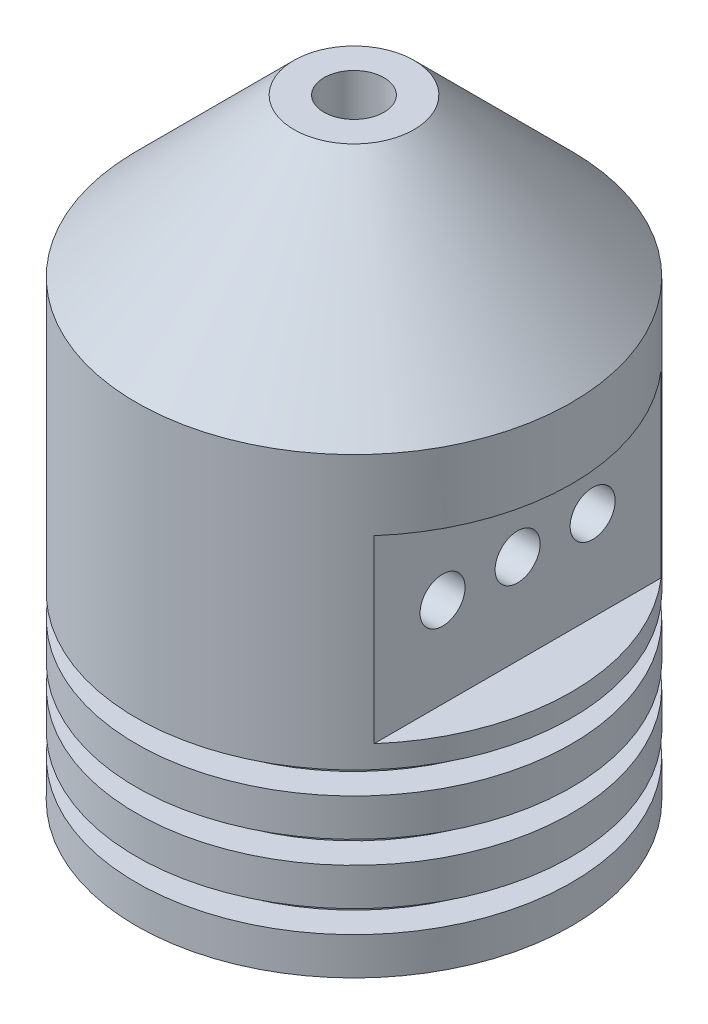
ISO-10303-21;
HEADER;
FILE_DESCRIPTION(('STEP AP214'),'2;1');
FILE_NAME('part.step','',(''),(''),'','','');
FILE_SCHEMA(('AUTOMOTIVE_DESIGN { 1 0 10303 214 1 1 1 1 }'));
ENDSEC;
DATA;
#1=APPLICATION_CONTEXT('core data for automotive mechanical design processes');
#2=APPLICATION_PROTOCOL_DEFINITION('international standard','automotive_design',2000,#1);
#3=PRODUCT_CONTEXT('',#1,'mechanical');
#4=PRODUCT('Part','Part','',(#3));
#5=PRODUCT_RELATED_PRODUCT_CATEGORY('part','',(#4));
#6=PRODUCT_DEFINITION_FORMATION('','',#4);
#7=PRODUCT_DEFINITION_CONTEXT('part definition',#1,'design');
#8=PRODUCT_DEFINITION('design','',#6,#7);
#9=PRODUCT_DEFINITION_SHAPE('','',#8);
#10=(LENGTH_UNIT() NAMED_UNIT(*) SI_UNIT(.MILLI.,.METRE.));
#11=(NAMED_UNIT(*) PLANE_ANGLE_UNIT() SI_UNIT($,.RADIAN.));
#12=(NAMED_UNIT(*) SI_UNIT($,.STERADIAN.) SOLID_ANGLE_UNIT());
#13=UNCERTAINTY_MEASURE_WITH_UNIT(LENGTH_MEASURE(1.E-05),#10,'distance_accuracy_value','');
#14=(GEOMETRIC_REPRESENTATION_CONTEXT(3) GLOBAL_UNCERTAINTY_ASSIGNED_CONTEXT((#13)) GLOBAL_UNIT_ASSIGNED_CONTEXT((#10,
#11,#12)) REPRESENTATION_CONTEXT('',''));
#15=CARTESIAN_POINT('',(0.,0.,0.));
#16=DIRECTION('',(0.,0.,1.));
#17=DIRECTION('',(1.,0.,0.));
#18=AXIS2_PLACEMENT_3D('',#15,#16,#17);
#19=CARTESIAN_POINT('',(2.9,20.5,0.));
#20=DIRECTION('',(1.,0.,0.));
#21=DIRECTION('',(0.,1.,0.));
#22=AXIS2_PLACEMENT_3D('',#19,#20,#21);
#23=CYLINDRICAL_SURFACE('',#22,1.5);
#24=CARTESIAN_POINT('',(10.9,20.5,0.));
#25=DIRECTION('',(1.,0.,0.));
#26=DIRECTION('',(0.,1.,0.));
#27=AXIS2_PLACEMENT_3D('',#24,#25,#26);
#28=CIRCLE('',#27,1.5);
#29=CARTESIAN_POINT('',(10.9,22.,0.));
#30=VERTEX_POINT('',#29);
#31=EDGE_CURVE('E192',#30,#30,#28,.T.);
#32=ORIENTED_EDGE('',*,*,#31,.T.);
#33=EDGE_LOOP('',(#32));
#34=FACE_BOUND('',#33,.T.);
#35=CARTESIAN_POINT('',(4.5,20.5,0.));
#36=DIRECTION('',(0.707106781186547,0.707106781186548,0.));
#37=DIRECTION('',(0.707106781186548,-0.707106781186547,0.));
#38=AXIS2_PLACEMENT_3D('',#35,#36,#37);
#39=ELLIPSE('',#38,2.12132034355964,1.5);
#40=CARTESIAN_POINT('',(4.5,20.5,-1.5));
#41=VERTEX_POINT('',#40);
#42=CARTESIAN_POINT('',(4.5,20.5,1.5));
#43=VERTEX_POINT('',#42);
#44=EDGE_CURVE('E55',#41,#43,#39,.F.);
#45=ORIENTED_EDGE('',*,*,#44,.T.);
#46=CARTESIAN_POINT('',(4.5,20.5,0.));
#47=DIRECTION('',(0.707106781186548,-0.707106781186547,0.));
#48=DIRECTION('',(0.707106781186547,0.707106781186548,0.));
#49=AXIS2_PLACEMENT_3D('',#46,#47,#48);
#50=ELLIPSE('',#49,2.12132034355964,1.5);
#51=EDGE_CURVE('E11',#43,#41,#50,.F.);
#52=ORIENTED_EDGE('',*,*,#51,.T.);
#53=EDGE_LOOP('',(#45,#52));
#54=FACE_BOUND('',#53,.T.);
#55=ADVANCED_FACE('F42',(#34,#54),#23,.F.);
#56=CARTESIAN_POINT('',(0.,0.,0.));
#57=DIRECTION('',(0.,1.,0.));
#58=DIRECTION('',(0.,0.,1.));
#59=AXIS2_PLACEMENT_3D('',#56,#57,#58);
#60=CYLINDRICAL_SURFACE('',#59,2.);
#61=CARTESIAN_POINT('',(0.,41.7,0.));
#62=DIRECTION('',(0.,1.,0.));
#63=DIRECTION('',(0.,0.,1.));
#64=AXIS2_PLACEMENT_3D('',#61,#62,#63);
#65=CIRCLE('',#64,2.);
#66=CARTESIAN_POINT('',(0.,41.7,2.));
#67=VERTEX_POINT('',#66);
#68=EDGE_CURVE('E129',#67,#67,#65,.T.);
#69=ORIENTED_EDGE('',*,*,#68,.T.);
#70=EDGE_LOOP('',(#69));
#71=FACE_BOUND('',#70,.T.);
#72=CARTESIAN_POINT('',(0.,17.5,0.));
#73=DIRECTION('',(0.,-1.,0.));
#74=DIRECTION('',(0.,0.,-1.));
#75=AXIS2_PLACEMENT_3D('',#72,#73,#74);
#76=CIRCLE('',#75,2.);
#77=CARTESIAN_POINT('',(0.,17.5,-2.));
#78=VERTEX_POINT('',#77);
#79=EDGE_CURVE('E89',#78,#78,#76,.F.);
#80=ORIENTED_EDGE('',*,*,#79,.F.);
#81=EDGE_LOOP('',(#80));
#82=FACE_BOUND('',#81,.T.);
#83=ADVANCED_FACE('F220',(#71,#82),#60,.F.);
#84=CARTESIAN_POINT('',(0.,41.7,0.));
#85=DIRECTION('',(0.,-1.,0.));
#86=DIRECTION('',(0.,0.,-1.));
#87=AXIS2_PLACEMENT_3D('',#84,#85,#86);
#88=CYLINDRICAL_SURFACE('',#87,14.5);
#89=CARTESIAN_POINT('',(0.,3.5,0.));
#90=DIRECTION('',(0.,-1.,0.));
#91=DIRECTION('',(0.,0.,-1.));
#92=AXIS2_PLACEMENT_3D('',#89,#90,#91);
#93=CIRCLE('',#92,14.5);
#94=CARTESIAN_POINT('',(0.,3.5,-14.5));
#95=VERTEX_POINT('',#94);
#96=EDGE_CURVE('E161',#95,#95,#93,.T.);
#97=ORIENTED_EDGE('',*,*,#96,.T.);
#98=EDGE_LOOP('',(#97));
#99=FACE_BOUND('',#98,.T.);
#100=CARTESIAN_POINT('',(0.,1.,0.));
#101=DIRECTION('',(0.,1.,0.));
#102=DIRECTION('',(0.,0.,1.));
#103=AXIS2_PLACEMENT_3D('',#100,#101,#102);
#104=CIRCLE('',#103,14.5);
#105=CARTESIAN_POINT('',(0.,1.,14.5));
#106=VERTEX_POINT('',#105);
#107=EDGE_CURVE('E120',#106,#106,#104,.T.);
#108=ORIENTED_EDGE('',*,*,#107,.T.);
#109=EDGE_LOOP('',(#108));
#110=FACE_BOUND('',#109,.T.);
#111=ADVANCED_FACE('F225',(#99,#110),#88,.T.);
#112=DIRECTION('',(0.,-1.,0.));
#113=VECTOR('',#112,1.);
#114=CARTESIAN_POINT('',(10.9,41.7,9.56242647030554));
#115=LINE('',#114,#113);
#116=CARTESIAN_POINT('',(10.9,14.5,9.56242647030554));
#117=VERTEX_POINT('',#116);
#118=CARTESIAN_POINT('',(10.9,26.5,9.56242647030554));
#119=VERTEX_POINT('',#118);
#120=EDGE_CURVE('E111',#117,#119,#115,.F.);
#121=ORIENTED_EDGE('',*,*,#120,.T.);
#122=CARTESIAN_POINT('',(0.,26.5,0.));
#123=DIRECTION('',(0.,1.,0.));
#124=DIRECTION('',(-1.,0.,0.));
#125=AXIS2_PLACEMENT_3D('',#122,#123,#124);
#126=CIRCLE('',#125,14.5);
#127=CARTESIAN_POINT('',(10.9,26.5,-9.56242647030554));
#128=VERTEX_POINT('',#127);
#129=EDGE_CURVE('E105',#119,#128,#126,.T.);
#130=ORIENTED_EDGE('',*,*,#129,.T.);
#131=DIRECTION('',(0.,-1.,0.));
#132=VECTOR('',#131,1.);
#133=CARTESIAN_POINT('',(10.9,41.7,-9.56242647030554));
#134=LINE('',#133,#132);
#135=CARTESIAN_POINT('',(10.9,14.5,-9.56242647030554));
#136=VERTEX_POINT('',#135);
#137=EDGE_CURVE('E108',#128,#136,#134,.T.);
#138=ORIENTED_EDGE('',*,*,#137,.T.);
#139=CARTESIAN_POINT('',(0.,14.5,0.));
#140=DIRECTION('',(0.,-1.,0.));
#141=DIRECTION('',(0.,0.,-1.));
#142=AXIS2_PLACEMENT_3D('',#139,#140,#141);
#143=CIRCLE('',#142,14.5);
#144=EDGE_CURVE('E114',#136,#117,#143,.T.);
#145=ORIENTED_EDGE('',*,*,#144,.T.);
#146=EDGE_LOOP('',(#121,#130,#138,#145));
#147=FACE_BOUND('',#146,.T.);
#148=CARTESIAN_POINT('',(0.,13.,0.));
#149=DIRECTION('',(0.,-1.,0.));
#150=DIRECTION('',(0.,0.,-1.));
#151=AXIS2_PLACEMENT_3D('',#148,#149,#150);
#152=CIRCLE('',#151,14.5);
#153=CARTESIAN_POINT('',(0.,13.,-14.5));
#154=VERTEX_POINT('',#153);
#155=EDGE_CURVE('E140',#154,#154,#152,.T.);
#156=ORIENTED_EDGE('',*,*,#155,.F.);
#157=EDGE_LOOP('',(#156));
#158=FACE_BOUND('',#157,.T.);
#159=CARTESIAN_POINT('',(0.,31.2,0.));
#160=DIRECTION('',(0.,1.,0.));
#161=DIRECTION('',(0.,0.,1.));
#162=AXIS2_PLACEMENT_3D('',#159,#160,#161);
#163=CIRCLE('',#162,14.5);
#164=CARTESIAN_POINT('',(0.,31.2,-14.5));
#165=VERTEX_POINT('',#164);
#166=EDGE_CURVE('E123',#165,#165,#163,.F.);
#167=ORIENTED_EDGE('',*,*,#166,.T.);
#168=EDGE_LOOP('',(#167));
#169=FACE_BOUND('',#168,.T.);
#170=ADVANCED_FACE('F319',(#147,#158,#169),#88,.T.);
#171=CARTESIAN_POINT('',(0.,41.7,0.));
#172=DIRECTION('',(0.,1.,0.));
#173=DIRECTION('',(0.,0.,1.));
#174=AXIS2_PLACEMENT_3D('',#171,#172,#173);
#175=PLANE('',#174);
#176=ORIENTED_EDGE('',*,*,#68,.F.);
#177=EDGE_LOOP('',(#176));
#178=FACE_BOUND('',#177,.T.);
#179=CARTESIAN_POINT('',(0.,41.7,0.));
#180=DIRECTION('',(0.,1.,0.));
#181=DIRECTION('',(0.,0.,1.));
#182=AXIS2_PLACEMENT_3D('',#179,#180,#181);
#183=CIRCLE('',#182,4.);
#184=CARTESIAN_POINT('',(0.,41.7,-4.));
#185=VERTEX_POINT('',#184);
#186=EDGE_CURVE('E126',#185,#185,#183,.T.);
#187=ORIENTED_EDGE('',*,*,#186,.T.);
#188=EDGE_LOOP('',(#187));
#189=FACE_BOUND('',#188,.T.);
#190=ADVANCED_FACE('F315',(#178,#189),#175,.T.);
#191=CARTESIAN_POINT('',(0.,0.,0.));
#192=DIRECTION('',(0.,1.,0.));
#193=DIRECTION('',(0.,0.,1.));
#194=AXIS2_PLACEMENT_3D('',#191,#192,#193);
#195=PLANE('',#194);
#196=CARTESIAN_POINT('',(0.,0.,0.));
#197=DIRECTION('',(0.,1.,0.));
#198=DIRECTION('',(0.,0.,1.));
#199=AXIS2_PLACEMENT_3D('',#196,#197,#198);
#200=CIRCLE('',#199,9.15000000000001);
#201=CARTESIAN_POINT('',(0.,0.,9.15000000000001));
#202=VERTEX_POINT('',#201);
#203=EDGE_CURVE('E99',#202,#202,#200,.T.);
#204=ORIENTED_EDGE('',*,*,#203,.T.);
#205=EDGE_LOOP('',(#204));
#206=FACE_BOUND('',#205,.T.);
#207=CARTESIAN_POINT('',(0.,0.,0.));
#208=DIRECTION('',(0.,1.,0.));
#209=DIRECTION('',(0.,0.,1.));
#210=AXIS2_PLACEMENT_3D('',#207,#208,#209);
#211=CIRCLE('',#210,9.49999999999991);
#212=CARTESIAN_POINT('',(0.,0.,9.49999999999991));
#213=VERTEX_POINT('',#212);
#214=EDGE_CURVE('E117',#213,#213,#211,.F.);
#215=ORIENTED_EDGE('',*,*,#214,.T.);
#216=EDGE_LOOP('',(#215));
#217=FACE_BOUND('',#216,.T.);
#218=ADVANCED_FACE('F318',(#206,#217),#195,.F.);
#219=CARTESIAN_POINT('',(0.,41.7,0.));
#220=DIRECTION('',(0.,-1.,0.));
#221=DIRECTION('',(0.,0.,-1.));
#222=AXIS2_PLACEMENT_3D('',#219,#220,#221);
#223=CONICAL_SURFACE('',#222,4.,0.785398163397446);
#224=CARTESIAN_POINT('',(0.,31.2,-14.5));
#225=CARTESIAN_POINT('',(0.,31.309375,-14.390625));
#226=CARTESIAN_POINT('',(0.,31.41875,-14.28125));
#227=CARTESIAN_POINT('',(0.,31.6375,-14.0625));
#228=CARTESIAN_POINT('',(0.,31.746875,-13.953125));
#229=CARTESIAN_POINT('',(0.,31.965625,-13.734375));
#230=CARTESIAN_POINT('',(0.,32.075,-13.625));
#231=CARTESIAN_POINT('',(0.,32.29375,-13.40625));
#232=CARTESIAN_POINT('',(0.,32.403125,-13.296875));
#233=CARTESIAN_POINT('',(0.,32.621875,-13.078125));
#234=CARTESIAN_POINT('',(0.,32.73125,-12.96875));
#235=CARTESIAN_POINT('',(0.,32.95,-12.75));
#236=CARTESIAN_POINT('',(0.,33.059375,-12.640625));
#237=CARTESIAN_POINT('',(0.,33.278125,-12.421875));
#238=CARTESIAN_POINT('',(0.,33.3875,-12.3125));
#239=CARTESIAN_POINT('',(0.,33.60625,-12.09375));
#240=CARTESIAN_POINT('',(0.,33.715625,-11.984375));
#241=CARTESIAN_POINT('',(0.,33.934375,-11.765625));
#242=CARTESIAN_POINT('',(0.,34.04375,-11.65625));
#243=CARTESIAN_POINT('',(0.,34.2625,-11.4375));
#244=CARTESIAN_POINT('',(0.,34.371875,-11.328125));
#245=CARTESIAN_POINT('',(0.,34.590625,-11.109375));
#246=CARTESIAN_POINT('',(0.,34.7,-11.));
#247=CARTESIAN_POINT('',(0.,34.91875,-10.78125));
#248=CARTESIAN_POINT('',(0.,35.028125,-10.671875));
#249=CARTESIAN_POINT('',(0.,35.246875,-10.453125));
#250=CARTESIAN_POINT('',(0.,35.35625,-10.34375));
#251=CARTESIAN_POINT('',(0.,35.575,-10.125));
#252=CARTESIAN_POINT('',(0.,35.684375,-10.015625));
#253=CARTESIAN_POINT('',(0.,35.903125,-9.796875));
#254=CARTESIAN_POINT('',(0.,36.0125,-9.6875));
#255=CARTESIAN_POINT('',(0.,36.23125,-9.46875));
#256=CARTESIAN_POINT('',(0.,36.340625,-9.359375));
#257=CARTESIAN_POINT('',(0.,36.559375,-9.140625));
#258=CARTESIAN_POINT('',(0.,36.66875,-9.03125));
#259=CARTESIAN_POINT('',(0.,36.8875,-8.8125));
#260=CARTESIAN_POINT('',(0.,36.996875,-8.703125));
#261=CARTESIAN_POINT('',(0.,37.215625,-8.484375));
#262=CARTESIAN_POINT('',(0.,37.325,-8.375));
#263=CARTESIAN_POINT('',(0.,37.54375,-8.15625));
#264=CARTESIAN_POINT('',(0.,37.653125,-8.046875));
#265=CARTESIAN_POINT('',(0.,37.871875,-7.828125));
#266=CARTESIAN_POINT('',(0.,37.98125,-7.71875));
#267=CARTESIAN_POINT('',(0.,38.2,-7.5));
#268=CARTESIAN_POINT('',(0.,38.309375,-7.390625));
#269=CARTESIAN_POINT('',(0.,38.528125,-7.171875));
#270=CARTESIAN_POINT('',(0.,38.6375,-7.0625));
#271=CARTESIAN_POINT('',(0.,38.85625,-6.84375));
#272=CARTESIAN_POINT('',(0.,38.965625,-6.734375));
#273=CARTESIAN_POINT('',(0.,39.184375,-6.515625));
#274=CARTESIAN_POINT('',(0.,39.29375,-6.40625));
#275=CARTESIAN_POINT('',(0.,39.5125,-6.1875));
#276=CARTESIAN_POINT('',(0.,39.621875,-6.078125));
#277=CARTESIAN_POINT('',(0.,39.840625,-5.859375));
#278=CARTESIAN_POINT('',(0.,39.95,-5.75));
#279=CARTESIAN_POINT('',(0.,40.16875,-5.53125));
#280=CARTESIAN_POINT('',(0.,40.278125,-5.421875));
#281=CARTESIAN_POINT('',(0.,40.496875,-5.203125));
#282=CARTESIAN_POINT('',(0.,40.60625,-5.09375));
#283=CARTESIAN_POINT('',(0.,40.825,-4.875));
#284=CARTESIAN_POINT('',(0.,40.934375,-4.765625));
#285=CARTESIAN_POINT('',(0.,41.153125,-4.546875));
#286=CARTESIAN_POINT('',(0.,41.2625,-4.4375));
#287=CARTESIAN_POINT('',(0.,41.48125,-4.21875));
#288=CARTESIAN_POINT('',(0.,41.590625,-4.109375));
#289=CARTESIAN_POINT('',(0.,41.7,-4.));
#290=B_SPLINE_CURVE_WITH_KNOTS('',3,(#224,#225,#226,#227,#228,#229,#230,#231,#232,#233,#234,
#235,#236,#237,#238,#239,#240,#241,#242,#243,#244,#245,#246,#247,#248,#249,#250,#251,#252,#253,
#254,#255,#256,#257,#258,#259,#260,#261,#262,#263,#264,#265,#266,#267,#268,#269,#270,#271,#272,
#273,#274,#275,#276,#277,#278,#279,#280,#281,#282,#283,#284,#285,#286,#287,#288,#289),
.UNSPECIFIED.,.F.,.F.,(4,2,2,2,2,2,2,2,2,2,2,2,2,2,2,2,2,2,2,2,2,2,2,2,2,2,2,2,2,2,2,2,4),(0.,
0.464038825153673,0.928077650307343,1.39211647546102,1.85615530061469,2.32019412576836,
2.78423295092204,3.24827177607571,3.71231060122938,4.17634942638306,4.64038825153673,
5.1044270766904,5.56846590184407,6.03250472699775,6.49654355215142,6.9605823773051,
7.42462120245877,7.88866002761244,8.35269885276612,8.81673767791978,9.28077650307346,
9.74481532822713,10.2088541533808,10.6728929785345,11.1369318036881,11.6009706288418,
12.0650094539955,12.5290482791492,12.9930871043028,13.4571259294565,13.9211647546102,
14.3852035797639,14.8492424049175),.UNSPECIFIED.);
#291=EDGE_CURVE('BSEAM323',#165,#185,#290,.T.);
#292=ORIENTED_EDGE('',*,*,#166,.F.);
#293=ORIENTED_EDGE('',*,*,#186,.F.);
#294=ORIENTED_EDGE('',*,*,#291,.T.);
#295=ORIENTED_EDGE('',*,*,#291,.F.);
#296=EDGE_LOOP('',(#292,#294,#293,#295));
#297=FACE_BOUND('',#296,.T.);
#298=ADVANCED_FACE('F323',(#297),#223,.T.);
#299=CARTESIAN_POINT('',(0.,1.,0.));
#300=DIRECTION('',(0.,1.,0.));
#301=DIRECTION('',(0.,0.,1.));
#302=AXIS2_PLACEMENT_3D('',#299,#300,#301);
#303=CONICAL_SURFACE('',#302,14.5,1.37340076694502);
#304=ORIENTED_EDGE('',*,*,#214,.F.);
#305=EDGE_LOOP('',(#304));
#306=FACE_BOUND('',#305,.T.);
#307=ORIENTED_EDGE('',*,*,#107,.F.);
#308=EDGE_LOOP('',(#307));
#309=FACE_BOUND('',#308,.T.);
#310=ADVANCED_FACE('F312',(#306,#309),#303,.T.);
#311=CARTESIAN_POINT('',(0.,0.,0.));
#312=DIRECTION('',(0.,-1.,0.));
#313=DIRECTION('',(0.,0.,-1.));
#314=AXIS2_PLACEMENT_3D('',#311,#312,#313);
#315=CYLINDRICAL_SURFACE('',#314,12.5);
#316=CARTESIAN_POINT('',(0.,11.5,0.));
#317=DIRECTION('',(0.,-1.,0.));
#318=DIRECTION('',(0.,0.,-1.));
#319=AXIS2_PLACEMENT_3D('',#316,#317,#318);
#320=CIRCLE('',#319,12.5);
#321=CARTESIAN_POINT('',(0.,11.5,-12.5));
#322=VERTEX_POINT('',#321);
#323=EDGE_CURVE('E133',#322,#322,#320,.T.);
#324=ORIENTED_EDGE('',*,*,#323,.F.);
#325=EDGE_LOOP('',(#324));
#326=FACE_BOUND('',#325,.T.);
#327=CARTESIAN_POINT('',(0.,13.,0.));
#328=DIRECTION('',(0.,-1.,0.));
#329=DIRECTION('',(0.,0.,-1.));
#330=AXIS2_PLACEMENT_3D('',#327,#328,#329);
#331=CIRCLE('',#330,12.5);
#332=CARTESIAN_POINT('',(0.,13.,-12.5));
#333=VERTEX_POINT('',#332);
#334=EDGE_CURVE('E143',#333,#333,#331,.T.);
#335=ORIENTED_EDGE('',*,*,#334,.T.);
#336=EDGE_LOOP('',(#335));
#337=FACE_BOUND('',#336,.T.);
#338=ADVANCED_FACE('F309',(#326,#337),#315,.T.);
#339=CARTESIAN_POINT('',(12.5,11.5,0.));
#340=DIRECTION('',(0.,-1.,0.));
#341=DIRECTION('',(0.,0.,-1.));
#342=AXIS2_PLACEMENT_3D('',#339,#340,#341);
#343=PLANE('',#342);
#344=CARTESIAN_POINT('',(0.,11.5,0.));
#345=DIRECTION('',(0.,-1.,0.));
#346=DIRECTION('',(0.,0.,-1.));
#347=AXIS2_PLACEMENT_3D('',#344,#345,#346);
#348=CIRCLE('',#347,14.5);
#349=CARTESIAN_POINT('',(0.,11.5,-14.5));
#350=VERTEX_POINT('',#349);
#351=EDGE_CURVE('E137',#350,#350,#348,.T.);
#352=ORIENTED_EDGE('',*,*,#351,.F.);
#353=EDGE_LOOP('',(#352));
#354=FACE_BOUND('',#353,.T.);
#355=ORIENTED_EDGE('',*,*,#323,.T.);
#356=EDGE_LOOP('',(#355));
#357=FACE_BOUND('',#356,.T.);
#358=ADVANCED_FACE('F305',(#354,#357),#343,.F.);
#359=CARTESIAN_POINT('',(12.5,13.,0.));
#360=DIRECTION('',(0.,1.,0.));
#361=DIRECTION('',(0.,0.,1.));
#362=AXIS2_PLACEMENT_3D('',#359,#360,#361);
#363=PLANE('',#362);
#364=ORIENTED_EDGE('',*,*,#334,.F.);
#365=EDGE_LOOP('',(#364));
#366=FACE_BOUND('',#365,.T.);
#367=ORIENTED_EDGE('',*,*,#155,.T.);
#368=EDGE_LOOP('',(#367));
#369=FACE_BOUND('',#368,.T.);
#370=ADVANCED_FACE('F302',(#366,#369),#363,.F.);
#371=CARTESIAN_POINT('',(0.,9.,0.));
#372=DIRECTION('',(0.,-1.,0.));
#373=DIRECTION('',(0.,0.,-1.));
#374=AXIS2_PLACEMENT_3D('',#371,#372,#373);
#375=CIRCLE('',#374,14.5);
#376=CARTESIAN_POINT('',(0.,9.,-14.5));
#377=VERTEX_POINT('',#376);
#378=EDGE_CURVE('E154',#377,#377,#375,.T.);
#379=ORIENTED_EDGE('',*,*,#378,.F.);
#380=EDGE_LOOP('',(#379));
#381=FACE_BOUND('',#380,.T.);
#382=ORIENTED_EDGE('',*,*,#351,.T.);
#383=EDGE_LOOP('',(#382));
#384=FACE_BOUND('',#383,.T.);
#385=ADVANCED_FACE('F300',(#381,#384),#88,.T.);
#386=CARTESIAN_POINT('',(0.,0.,0.));
#387=DIRECTION('',(0.,-1.,0.));
#388=DIRECTION('',(0.,0.,-1.));
#389=AXIS2_PLACEMENT_3D('',#386,#387,#388);
#390=CYLINDRICAL_SURFACE('',#389,12.5);
#391=CARTESIAN_POINT('',(0.,7.5,0.));
#392=DIRECTION('',(0.,-1.,0.));
#393=DIRECTION('',(0.,0.,-1.));
#394=AXIS2_PLACEMENT_3D('',#391,#392,#393);
#395=CIRCLE('',#394,12.5);
#396=CARTESIAN_POINT('',(0.,7.5,-12.5));
#397=VERTEX_POINT('',#396);
#398=EDGE_CURVE('E147',#397,#397,#395,.T.);
#399=ORIENTED_EDGE('',*,*,#398,.F.);
#400=EDGE_LOOP('',(#399));
#401=FACE_BOUND('',#400,.T.);
#402=CARTESIAN_POINT('',(0.,9.,0.));
#403=DIRECTION('',(0.,-1.,0.));
#404=DIRECTION('',(0.,0.,-1.));
#405=AXIS2_PLACEMENT_3D('',#402,#403,#404);
#406=CIRCLE('',#405,12.5);
#407=CARTESIAN_POINT('',(0.,9.,-12.5));
#408=VERTEX_POINT('',#407);
#409=EDGE_CURVE('E136',#408,#408,#406,.T.);
#410=ORIENTED_EDGE('',*,*,#409,.T.);
#411=EDGE_LOOP('',(#410));
#412=FACE_BOUND('',#411,.T.);
#413=ADVANCED_FACE('F296',(#401,#412),#390,.T.);
#414=CARTESIAN_POINT('',(12.5,7.5,0.));
#415=DIRECTION('',(0.,-1.,0.));
#416=DIRECTION('',(0.,0.,-1.));
#417=AXIS2_PLACEMENT_3D('',#414,#415,#416);
#418=PLANE('',#417);
#419=CARTESIAN_POINT('',(0.,7.5,0.));
#420=DIRECTION('',(0.,-1.,0.));
#421=DIRECTION('',(0.,0.,-1.));
#422=AXIS2_PLACEMENT_3D('',#419,#420,#421);
#423=CIRCLE('',#422,14.5);
#424=CARTESIAN_POINT('',(0.,7.5,-14.5));
#425=VERTEX_POINT('',#424);
#426=EDGE_CURVE('E151',#425,#425,#423,.T.);
#427=ORIENTED_EDGE('',*,*,#426,.F.);
#428=EDGE_LOOP('',(#427));
#429=FACE_BOUND('',#428,.T.);
#430=ORIENTED_EDGE('',*,*,#398,.T.);
#431=EDGE_LOOP('',(#430));
#432=FACE_BOUND('',#431,.T.);
#433=ADVANCED_FACE('F292',(#429,#432),#418,.F.);
#434=CARTESIAN_POINT('',(12.5,9.,0.));
#435=DIRECTION('',(0.,1.,0.));
#436=DIRECTION('',(0.,0.,1.));
#437=AXIS2_PLACEMENT_3D('',#434,#435,#436);
#438=PLANE('',#437);
#439=ORIENTED_EDGE('',*,*,#409,.F.);
#440=EDGE_LOOP('',(#439));
#441=FACE_BOUND('',#440,.T.);
#442=ORIENTED_EDGE('',*,*,#378,.T.);
#443=EDGE_LOOP('',(#442));
#444=FACE_BOUND('',#443,.T.);
#445=ADVANCED_FACE('F289',(#441,#444),#438,.F.);
#446=CARTESIAN_POINT('',(0.,5.,0.));
#447=DIRECTION('',(0.,-1.,0.));
#448=DIRECTION('',(0.,0.,-1.));
#449=AXIS2_PLACEMENT_3D('',#446,#447,#448);
#450=CIRCLE('',#449,14.5);
#451=CARTESIAN_POINT('',(0.,5.,-14.5));
#452=VERTEX_POINT('',#451);
#453=EDGE_CURVE('E164',#452,#452,#450,.T.);
#454=ORIENTED_EDGE('',*,*,#453,.F.);
#455=EDGE_LOOP('',(#454));
#456=FACE_BOUND('',#455,.T.);
#457=ORIENTED_EDGE('',*,*,#426,.T.);
#458=EDGE_LOOP('',(#457));
#459=FACE_BOUND('',#458,.T.);
#460=ADVANCED_FACE('F287',(#456,#459),#88,.T.);
#461=CARTESIAN_POINT('',(0.,0.,0.));
#462=DIRECTION('',(0.,-1.,0.));
#463=DIRECTION('',(0.,0.,-1.));
#464=AXIS2_PLACEMENT_3D('',#461,#462,#463);
#465=CYLINDRICAL_SURFACE('',#464,12.5);
#466=CARTESIAN_POINT('',(0.,3.5,0.));
#467=DIRECTION('',(0.,-1.,0.));
#468=DIRECTION('',(0.,0.,-1.));
#469=AXIS2_PLACEMENT_3D('',#466,#467,#468);
#470=CIRCLE('',#469,12.5);
#471=CARTESIAN_POINT('',(0.,3.5,-12.5));
#472=VERTEX_POINT('',#471);
#473=EDGE_CURVE('E132',#472,#472,#470,.T.);
#474=ORIENTED_EDGE('',*,*,#473,.F.);
#475=EDGE_LOOP('',(#474));
#476=FACE_BOUND('',#475,.T.);
#477=CARTESIAN_POINT('',(0.,5.,0.));
#478=DIRECTION('',(0.,-1.,0.));
#479=DIRECTION('',(0.,0.,-1.));
#480=AXIS2_PLACEMENT_3D('',#477,#478,#479);
#481=CIRCLE('',#480,12.5);
#482=CARTESIAN_POINT('',(0.,5.,-12.5));
#483=VERTEX_POINT('',#482);
#484=EDGE_CURVE('E150',#483,#483,#481,.T.);
#485=ORIENTED_EDGE('',*,*,#484,.T.);
#486=EDGE_LOOP('',(#485));
#487=FACE_BOUND('',#486,.T.);
#488=ADVANCED_FACE('F283',(#476,#487),#465,.T.);
#489=CARTESIAN_POINT('',(12.5,3.5,0.));
#490=DIRECTION('',(0.,-1.,0.));
#491=DIRECTION('',(0.,0.,-1.));
#492=AXIS2_PLACEMENT_3D('',#489,#490,#491);
#493=PLANE('',#492);
#494=ORIENTED_EDGE('',*,*,#96,.F.);
#495=EDGE_LOOP('',(#494));
#496=FACE_BOUND('',#495,.T.);
#497=ORIENTED_EDGE('',*,*,#473,.T.);
#498=EDGE_LOOP('',(#497));
#499=FACE_BOUND('',#498,.T.);
#500=ADVANCED_FACE('F279',(#496,#499),#493,.F.);
#501=CARTESIAN_POINT('',(12.5,5.,0.));
#502=DIRECTION('',(0.,1.,0.));
#503=DIRECTION('',(0.,0.,1.));
#504=AXIS2_PLACEMENT_3D('',#501,#502,#503);
#505=PLANE('',#504);
#506=ORIENTED_EDGE('',*,*,#484,.F.);
#507=EDGE_LOOP('',(#506));
#508=FACE_BOUND('',#507,.T.);
#509=ORIENTED_EDGE('',*,*,#453,.T.);
#510=EDGE_LOOP('',(#509));
#511=FACE_BOUND('',#510,.T.);
#512=ADVANCED_FACE('F275',(#508,#511),#505,.F.);
#513=CARTESIAN_POINT('',(10.9,26.5,-14.5));
#514=DIRECTION('',(-1.,0.,0.));
#515=DIRECTION('',(0.,-1.,0.));
#516=AXIS2_PLACEMENT_3D('',#513,#514,#515);
#517=PLANE('',#516);
#518=ORIENTED_EDGE('',*,*,#31,.F.);
#519=EDGE_LOOP('',(#518));
#520=FACE_BOUND('',#519,.T.);
#521=CARTESIAN_POINT('',(10.9,20.5,5.));
#522=DIRECTION('',(1.,0.,0.));
#523=DIRECTION('',(0.,1.,0.));
#524=AXIS2_PLACEMENT_3D('',#521,#522,#523);
#525=CIRCLE('',#524,1.5);
#526=CARTESIAN_POINT('',(10.9,22.,5.));
#527=VERTEX_POINT('',#526);
#528=EDGE_CURVE('E187',#527,#527,#525,.T.);
#529=ORIENTED_EDGE('',*,*,#528,.F.);
#530=EDGE_LOOP('',(#529));
#531=FACE_BOUND('',#530,.T.);
#532=CARTESIAN_POINT('',(10.9,20.5,-5.));
#533=DIRECTION('',(1.,0.,0.));
#534=DIRECTION('',(0.,1.,0.));
#535=AXIS2_PLACEMENT_3D('',#532,#533,#534);
#536=CIRCLE('',#535,1.5);
#537=CARTESIAN_POINT('',(10.9,22.,-5.));
#538=VERTEX_POINT('',#537);
#539=EDGE_CURVE('E180',#538,#538,#536,.T.);
#540=ORIENTED_EDGE('',*,*,#539,.F.);
#541=EDGE_LOOP('',(#540));
#542=FACE_BOUND('',#541,.T.);
#543=DIRECTION('',(0.,0.,1.));
#544=VECTOR('',#543,1.);
#545=CARTESIAN_POINT('',(10.9,26.5,-14.5));
#546=LINE('',#545,#544);
#547=EDGE_CURVE('E146',#128,#119,#546,.T.);
#548=ORIENTED_EDGE('',*,*,#547,.T.);
#549=ORIENTED_EDGE('',*,*,#120,.F.);
#550=DIRECTION('',(0.,0.,1.));
#551=VECTOR('',#550,1.);
#552=CARTESIAN_POINT('',(10.9,14.5,-14.5));
#553=LINE('',#552,#551);
#554=EDGE_CURVE('E62',#136,#117,#553,.T.);
#555=ORIENTED_EDGE('',*,*,#554,.F.);
#556=ORIENTED_EDGE('',*,*,#137,.F.);
#557=EDGE_LOOP('',(#548,#549,#555,#556));
#558=FACE_BOUND('',#557,.T.);
#559=ADVANCED_FACE('F269',(#520,#531,#542,#558),#517,.F.);
#560=CARTESIAN_POINT('',(10.9,26.5,-14.5));
#561=DIRECTION('',(0.,1.,0.));
#562=DIRECTION('',(-1.,0.,0.));
#563=AXIS2_PLACEMENT_3D('',#560,#561,#562);
#564=PLANE('',#563);
#565=ORIENTED_EDGE('',*,*,#547,.F.);
#566=ORIENTED_EDGE('',*,*,#129,.F.);
#567=EDGE_LOOP('',(#565,#566));
#568=FACE_BOUND('',#567,.T.);
#569=ADVANCED_FACE('F266',(#568),#564,.F.);
#570=CARTESIAN_POINT('',(10.9,14.5,-14.5));
#571=DIRECTION('',(0.,-1.,0.));
#572=DIRECTION('',(0.,0.,-1.));
#573=AXIS2_PLACEMENT_3D('',#570,#571,#572);
#574=PLANE('',#573);
#575=ORIENTED_EDGE('',*,*,#554,.T.);
#576=ORIENTED_EDGE('',*,*,#144,.F.);
#577=EDGE_LOOP('',(#575,#576));
#578=FACE_BOUND('',#577,.T.);
#579=ADVANCED_FACE('F264',(#578),#574,.F.);
#580=CARTESIAN_POINT('',(0.,5.6,0.));
#581=DIRECTION('',(0.,-1.,0.));
#582=DIRECTION('',(0.,0.,-1.));
#583=AXIS2_PLACEMENT_3D('',#580,#581,#582);
#584=CYLINDRICAL_SURFACE('',#583,8.65);
#585=CARTESIAN_POINT('',(0.,0.500000000000006,0.));
#586=DIRECTION('',(0.,1.,0.));
#587=DIRECTION('',(0.,0.,1.));
#588=AXIS2_PLACEMENT_3D('',#585,#586,#587);
#589=CIRCLE('',#588,8.65);
#590=CARTESIAN_POINT('',(0.,0.500000000000006,8.65));
#591=VERTEX_POINT('',#590);
#592=EDGE_CURVE('E102',#591,#591,#589,.F.);
#593=ORIENTED_EDGE('',*,*,#592,.T.);
#594=EDGE_LOOP('',(#593));
#595=FACE_BOUND('',#594,.T.);
#596=CARTESIAN_POINT('',(0.,5.6,0.));
#597=DIRECTION('',(0.,-1.,0.));
#598=DIRECTION('',(0.,0.,-1.));
#599=AXIS2_PLACEMENT_3D('',#596,#597,#598);
#600=CIRCLE('',#599,8.65);
#601=CARTESIAN_POINT('',(0.,5.6,-8.65));
#602=VERTEX_POINT('',#601);
#603=EDGE_CURVE('E170',#602,#602,#600,.T.);
#604=ORIENTED_EDGE('',*,*,#603,.F.);
#605=EDGE_LOOP('',(#604));
#606=FACE_BOUND('',#605,.T.);
#607=ADVANCED_FACE('F261',(#595,#606),#584,.F.);
#608=CARTESIAN_POINT('',(0.,0.500000000000006,0.));
#609=DIRECTION('',(0.,-1.,0.));
#610=DIRECTION('',(0.,0.,-1.));
#611=AXIS2_PLACEMENT_3D('',#608,#609,#610);
#612=CONICAL_SURFACE('',#611,8.65,0.785398163397453);
#613=ORIENTED_EDGE('',*,*,#203,.F.);
#614=EDGE_LOOP('',(#613));
#615=FACE_BOUND('',#614,.T.);
#616=ORIENTED_EDGE('',*,*,#592,.F.);
#617=EDGE_LOOP('',(#616));
#618=FACE_BOUND('',#617,.T.);
#619=ADVANCED_FACE('F256',(#615,#618),#612,.F.);
#620=CARTESIAN_POINT('',(0.,15.6,0.));
#621=DIRECTION('',(0.,-1.,0.));
#622=DIRECTION('',(0.,0.,-1.));
#623=AXIS2_PLACEMENT_3D('',#620,#621,#622);
#624=PLANE('',#623);
#625=CARTESIAN_POINT('',(0.,15.6,0.));
#626=DIRECTION('',(0.,-1.,0.));
#627=DIRECTION('',(0.,0.,-1.));
#628=AXIS2_PLACEMENT_3D('',#625,#626,#627);
#629=CIRCLE('',#628,7.);
#630=CARTESIAN_POINT('',(0.,15.6,-7.));
#631=VERTEX_POINT('',#630);
#632=EDGE_CURVE('E93',#631,#631,#629,.T.);
#633=ORIENTED_EDGE('',*,*,#632,.F.);
#634=EDGE_LOOP('',(#633));
#635=FACE_BOUND('',#634,.T.);
#636=CARTESIAN_POINT('',(0.,15.6,0.));
#637=DIRECTION('',(0.,-1.,0.));
#638=DIRECTION('',(0.,0.,-1.));
#639=AXIS2_PLACEMENT_3D('',#636,#637,#638);
#640=CIRCLE('',#639,8.15);
#641=CARTESIAN_POINT('',(0.,15.6,-8.15));
#642=VERTEX_POINT('',#641);
#643=EDGE_CURVE('E92',#642,#642,#640,.T.);
#644=ORIENTED_EDGE('',*,*,#643,.T.);
#645=EDGE_LOOP('',(#644));
#646=FACE_BOUND('',#645,.T.);
#647=ADVANCED_FACE('F252',(#635,#646),#624,.T.);
#648=CARTESIAN_POINT('',(0.,15.6,0.));
#649=DIRECTION('',(0.,-1.,0.));
#650=DIRECTION('',(0.,0.,-1.));
#651=AXIS2_PLACEMENT_3D('',#648,#649,#650);
#652=CYLINDRICAL_SURFACE('',#651,8.15);
#653=CARTESIAN_POINT('',(0.,6.1,0.));
#654=DIRECTION('',(0.,-1.,0.));
#655=DIRECTION('',(0.,0.,-1.));
#656=AXIS2_PLACEMENT_3D('',#653,#654,#655);
#657=CIRCLE('',#656,8.15);
#658=CARTESIAN_POINT('',(0.,6.1,-8.15));
#659=VERTEX_POINT('',#658);
#660=EDGE_CURVE('E84',#659,#659,#657,.T.);
#661=ORIENTED_EDGE('',*,*,#660,.T.);
#662=EDGE_LOOP('',(#661));
#663=FACE_BOUND('',#662,.T.);
#664=ORIENTED_EDGE('',*,*,#643,.F.);
#665=EDGE_LOOP('',(#664));
#666=FACE_BOUND('',#665,.T.);
#667=ADVANCED_FACE('F255',(#663,#666),#652,.F.);
#668=CARTESIAN_POINT('',(0.,6.1,0.));
#669=DIRECTION('',(0.,-1.,0.));
#670=DIRECTION('',(0.,0.,-1.));
#671=AXIS2_PLACEMENT_3D('',#668,#669,#670);
#672=CONICAL_SURFACE('',#671,8.15,0.785398163397455);
#673=ORIENTED_EDGE('',*,*,#603,.T.);
#674=EDGE_LOOP('',(#673));
#675=FACE_BOUND('',#674,.T.);
#676=ORIENTED_EDGE('',*,*,#660,.F.);
#677=EDGE_LOOP('',(#676));
#678=FACE_BOUND('',#677,.T.);
#679=ADVANCED_FACE('F44',(#675,#678),#672,.F.);
#680=CARTESIAN_POINT('',(0.,17.5,0.));
#681=DIRECTION('',(0.,-1.,0.));
#682=DIRECTION('',(0.,0.,-1.));
#683=AXIS2_PLACEMENT_3D('',#680,#681,#682);
#684=PLANE('',#683);
#685=CARTESIAN_POINT('',(4.5,17.5,0.));
#686=DIRECTION('',(0.,-1.,0.));
#687=DIRECTION('',(0.,0.,-1.));
#688=AXIS2_PLACEMENT_3D('',#685,#686,#687);
#689=CIRCLE('',#688,1.5);
#690=CARTESIAN_POINT('',(4.5,17.5,-1.5));
#691=VERTEX_POINT('',#690);
#692=EDGE_CURVE('E198',#691,#691,#689,.T.);
#693=ORIENTED_EDGE('',*,*,#692,.F.);
#694=EDGE_LOOP('',(#693));
#695=FACE_BOUND('',#694,.T.);
#696=CARTESIAN_POINT('',(0.,17.5,0.));
#697=DIRECTION('',(0.,-1.,0.));
#698=DIRECTION('',(0.,0.,-1.));
#699=AXIS2_PLACEMENT_3D('',#696,#697,#698);
#700=CIRCLE('',#699,7.);
#701=CARTESIAN_POINT('',(0.,17.5,-7.));
#702=VERTEX_POINT('',#701);
#703=EDGE_CURVE('E96',#702,#702,#700,.T.);
#704=ORIENTED_EDGE('',*,*,#703,.T.);
#705=EDGE_LOOP('',(#704));
#706=FACE_BOUND('',#705,.T.);
#707=ORIENTED_EDGE('',*,*,#79,.T.);
#708=EDGE_LOOP('',(#707));
#709=FACE_BOUND('',#708,.T.);
#710=ADVANCED_FACE('F245',(#695,#706,#709),#684,.T.);
#711=CARTESIAN_POINT('',(0.,17.5,0.));
#712=DIRECTION('',(0.,-1.,0.));
#713=DIRECTION('',(0.,0.,-1.));
#714=AXIS2_PLACEMENT_3D('',#711,#712,#713);
#715=CYLINDRICAL_SURFACE('',#714,7.);
#716=ORIENTED_EDGE('',*,*,#632,.T.);
#717=EDGE_LOOP('',(#716));
#718=FACE_BOUND('',#717,.T.);
#719=ORIENTED_EDGE('',*,*,#703,.F.);
#720=EDGE_LOOP('',(#719));
#721=FACE_BOUND('',#720,.T.);
#722=ADVANCED_FACE('F243',(#718,#721),#715,.F.);
#723=CARTESIAN_POINT('',(2.9,20.5,-5.));
#724=DIRECTION('',(1.,0.,0.));
#725=DIRECTION('',(0.,1.,0.));
#726=AXIS2_PLACEMENT_3D('',#723,#724,#725);
#727=CYLINDRICAL_SURFACE('',#726,1.5);
#728=CARTESIAN_POINT('',(2.9,20.5,-5.));
#729=DIRECTION('',(1.,0.,0.));
#730=DIRECTION('',(0.,1.,0.));
#731=AXIS2_PLACEMENT_3D('',#728,#729,#730);
#732=CIRCLE('',#731,1.5);
#733=CARTESIAN_POINT('',(2.9,22.,-5.));
#734=VERTEX_POINT('',#733);
#735=EDGE_CURVE('E183',#734,#734,#732,.T.);
#736=ORIENTED_EDGE('',*,*,#735,.F.);
#737=EDGE_LOOP('',(#736));
#738=FACE_BOUND('',#737,.T.);
#739=ORIENTED_EDGE('',*,*,#539,.T.);
#740=EDGE_LOOP('',(#739));
#741=FACE_BOUND('',#740,.T.);
#742=ADVANCED_FACE('F239',(#738,#741),#727,.F.);
#743=CARTESIAN_POINT('',(2.9,0.,0.));
#744=DIRECTION('',(1.,0.,0.));
#745=DIRECTION('',(0.,1.,0.));
#746=AXIS2_PLACEMENT_3D('',#743,#744,#745);
#747=PLANE('',#746);
#748=ORIENTED_EDGE('',*,*,#735,.T.);
#749=EDGE_LOOP('',(#748));
#750=FACE_BOUND('',#749,.T.);
#751=ADVANCED_FACE('F235',(#750),#747,.T.);
#752=CARTESIAN_POINT('',(2.9,20.5,5.));
#753=DIRECTION('',(1.,0.,0.));
#754=DIRECTION('',(0.,1.,0.));
#755=AXIS2_PLACEMENT_3D('',#752,#753,#754);
#756=CYLINDRICAL_SURFACE('',#755,1.5);
#757=CARTESIAN_POINT('',(2.9,20.5,5.));
#758=DIRECTION('',(1.,0.,0.));
#759=DIRECTION('',(0.,1.,0.));
#760=AXIS2_PLACEMENT_3D('',#757,#758,#759);
#761=CIRCLE('',#760,1.5);
#762=CARTESIAN_POINT('',(2.9,22.,5.));
#763=VERTEX_POINT('',#762);
#764=EDGE_CURVE('E179',#763,#763,#761,.T.);
#765=ORIENTED_EDGE('',*,*,#764,.F.);
#766=EDGE_LOOP('',(#765));
#767=FACE_BOUND('',#766,.T.);
#768=ORIENTED_EDGE('',*,*,#528,.T.);
#769=EDGE_LOOP('',(#768));
#770=FACE_BOUND('',#769,.T.);
#771=ADVANCED_FACE('F231',(#767,#770),#756,.F.);
#772=CARTESIAN_POINT('',(2.9,0.,0.));
#773=DIRECTION('',(1.,0.,0.));
#774=DIRECTION('',(0.,1.,0.));
#775=AXIS2_PLACEMENT_3D('',#772,#773,#774);
#776=PLANE('',#775);
#777=ORIENTED_EDGE('',*,*,#764,.T.);
#778=EDGE_LOOP('',(#777));
#779=FACE_BOUND('',#778,.T.);
#780=ADVANCED_FACE('F217',(#779),#776,.T.);
#781=CARTESIAN_POINT('',(4.5,24.5,0.));
#782=DIRECTION('',(0.,-1.,0.));
#783=DIRECTION('',(0.,0.,-1.));
#784=AXIS2_PLACEMENT_3D('',#781,#782,#783);
#785=CYLINDRICAL_SURFACE('',#784,1.5);
#786=ORIENTED_EDGE('',*,*,#692,.T.);
#787=EDGE_LOOP('',(#786));
#788=FACE_BOUND('',#787,.T.);
#789=ORIENTED_EDGE('',*,*,#44,.F.);
#790=CARTESIAN_POINT('',(4.5,20.5,0.));
#791=DIRECTION('',(0.707106781186548,-0.707106781186547,0.));
#792=DIRECTION('',(0.707106781186547,0.707106781186548,0.));
#793=AXIS2_PLACEMENT_3D('',#790,#791,#792);
#794=ELLIPSE('',#793,2.12132034355964,1.5);
#795=EDGE_CURVE('E50',#43,#41,#794,.T.);
#796=ORIENTED_EDGE('',*,*,#795,.F.);
#797=EDGE_LOOP('',(#789,#796));
#798=FACE_BOUND('',#797,.T.);
#799=ADVANCED_FACE('F83',(#788,#798),#785,.F.);
#800=CARTESIAN_POINT('',(2.9,0.,0.));
#801=DIRECTION('',(1.,0.,0.));
#802=DIRECTION('',(0.,1.,0.));
#803=AXIS2_PLACEMENT_3D('',#800,#801,#802);
#804=PLANE('',#803);
#805=CARTESIAN_POINT('',(2.9,20.5,0.));
#806=DIRECTION('',(1.,0.,0.));
#807=DIRECTION('',(0.,1.,0.));
#808=AXIS2_PLACEMENT_3D('',#805,#806,#807);
#809=CIRCLE('',#808,1.5);
#810=CARTESIAN_POINT('',(2.9,22.,0.));
#811=VERTEX_POINT('',#810);
#812=EDGE_CURVE('E184',#811,#811,#809,.T.);
#813=ORIENTED_EDGE('',*,*,#812,.T.);
#814=EDGE_LOOP('',(#813));
#815=FACE_BOUND('',#814,.T.);
#816=ADVANCED_FACE('F213',(#815),#804,.T.);
#817=CARTESIAN_POINT('',(4.5,20.5,0.));
#818=DIRECTION('',(0.707106781186547,0.707106781186548,0.));
#819=DIRECTION('',(0.707106781186548,-0.707106781186547,0.));
#820=AXIS2_PLACEMENT_3D('',#817,#818,#819);
#821=ELLIPSE('',#820,2.12132034355964,1.5);
#822=EDGE_CURVE('E77',#41,#43,#821,.T.);
#823=ORIENTED_EDGE('',*,*,#822,.T.);
#824=ORIENTED_EDGE('',*,*,#795,.T.);
#825=EDGE_LOOP('',(#823,#824));
#826=FACE_BOUND('',#825,.T.);
#827=ORIENTED_EDGE('',*,*,#812,.F.);
#828=EDGE_LOOP('',(#827));
#829=FACE_BOUND('',#828,.T.);
#830=ADVANCED_FACE('F86',(#826,#829),#23,.F.);
#831=CARTESIAN_POINT('',(4.5,24.5,0.));
#832=DIRECTION('',(0.,-1.,0.));
#833=DIRECTION('',(0.,0.,-1.));
#834=AXIS2_PLACEMENT_3D('',#831,#832,#833);
#835=CIRCLE('',#834,1.5);
#836=CARTESIAN_POINT('',(4.5,24.5,-1.5));
#837=VERTEX_POINT('',#836);
#838=EDGE_CURVE('E195',#837,#837,#835,.T.);
#839=ORIENTED_EDGE('',*,*,#838,.F.);
#840=EDGE_LOOP('',(#839));
#841=FACE_BOUND('',#840,.T.);
#842=ORIENTED_EDGE('',*,*,#822,.F.);
#843=ORIENTED_EDGE('',*,*,#51,.F.);
#844=EDGE_LOOP('',(#842,#843));
#845=FACE_BOUND('',#844,.T.);
#846=ADVANCED_FACE('F78',(#841,#845),#785,.F.);
#847=CARTESIAN_POINT('',(4.5,24.5,0.));
#848=DIRECTION('',(0.,-1.,0.));
#849=DIRECTION('',(0.,0.,-1.));
#850=AXIS2_PLACEMENT_3D('',#847,#848,#849);
#851=PLANE('',#850);
#852=ORIENTED_EDGE('',*,*,#838,.T.);
#853=EDGE_LOOP('',(#852));
#854=FACE_BOUND('',#853,.T.);
#855=ADVANCED_FACE('F204',(#854),#851,.T.);
#856=CLOSED_SHELL('',(#55,#83,#111,#170,#190,#218,#298,#310,#338,#358,#370,#385,#413,#433,#445,
#460,#488,#500,#512,#559,#569,#579,#607,#619,#647,#667,#679,#710,#722,#742,#751,#771,#780,#799,
#816,#830,#846,#855));
#857=MANIFOLD_SOLID_BREP('B2',#856);
#858=ADVANCED_BREP_SHAPE_REPRESENTATION('',(#18,#857),#14);
#859=SHAPE_DEFINITION_REPRESENTATION(#9,#858);
ENDSEC;
END-ISO-10303-21;
